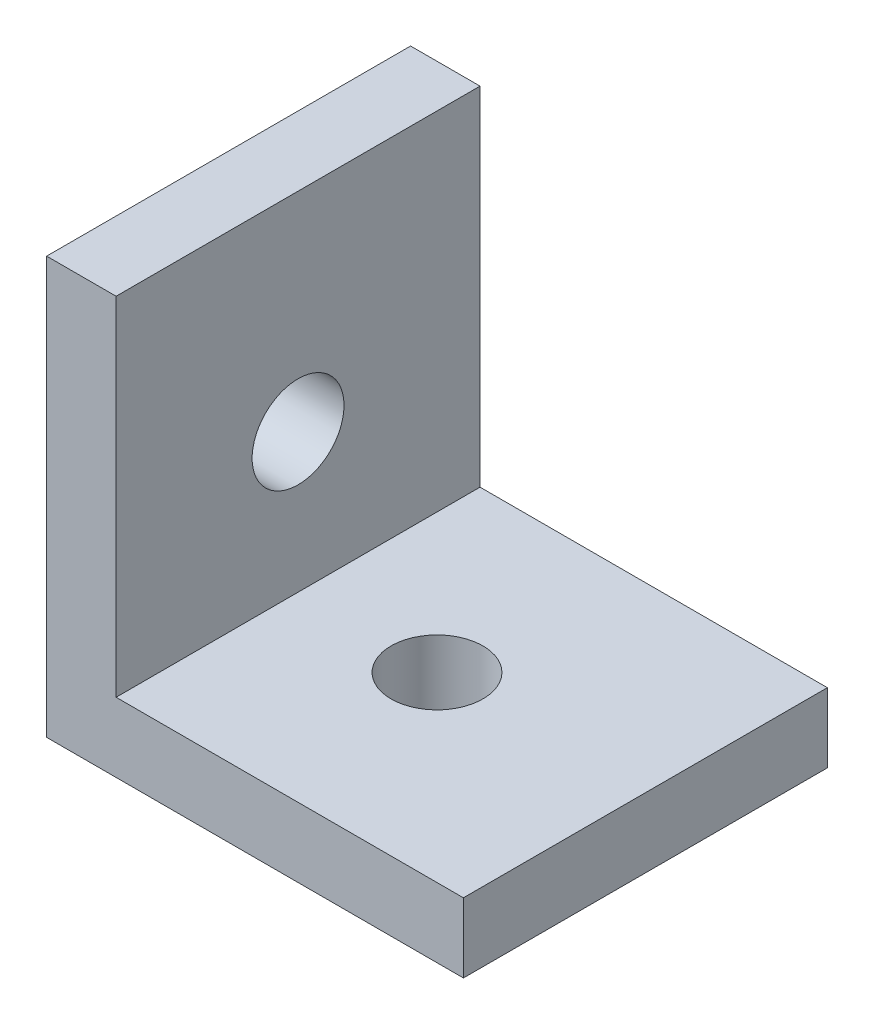
ISO-10303-21;
HEADER;
FILE_DESCRIPTION(('STEP AP214'),'2;1');
FILE_NAME('part.step','',(''),(''),'','','');
FILE_SCHEMA(('AUTOMOTIVE_DESIGN { 1 0 10303 214 1 1 1 1 }'));
ENDSEC;
DATA;
#1=APPLICATION_CONTEXT('core data for automotive mechanical design processes');
#2=APPLICATION_PROTOCOL_DEFINITION('international standard','automotive_design',2000,#1);
#3=PRODUCT_CONTEXT('',#1,'mechanical');
#4=PRODUCT('Part','Part','',(#3));
#5=PRODUCT_RELATED_PRODUCT_CATEGORY('part','',(#4));
#6=PRODUCT_DEFINITION_FORMATION('','',#4);
#7=PRODUCT_DEFINITION_CONTEXT('part definition',#1,'design');
#8=PRODUCT_DEFINITION('design','',#6,#7);
#9=PRODUCT_DEFINITION_SHAPE('','',#8);
#10=(LENGTH_UNIT() NAMED_UNIT(*) SI_UNIT(.MILLI.,.METRE.));
#11=(NAMED_UNIT(*) PLANE_ANGLE_UNIT() SI_UNIT($,.RADIAN.));
#12=(NAMED_UNIT(*) SI_UNIT($,.STERADIAN.) SOLID_ANGLE_UNIT());
#13=UNCERTAINTY_MEASURE_WITH_UNIT(LENGTH_MEASURE(1.E-05),#10,'distance_accuracy_value','');
#14=(GEOMETRIC_REPRESENTATION_CONTEXT(3) GLOBAL_UNCERTAINTY_ASSIGNED_CONTEXT((#13)) GLOBAL_UNIT_ASSIGNED_CONTEXT((#10,
#11,#12)) REPRESENTATION_CONTEXT('',''));
#15=CARTESIAN_POINT('',(0.,0.,0.));
#16=DIRECTION('',(0.,0.,1.));
#17=DIRECTION('',(1.,0.,0.));
#18=AXIS2_PLACEMENT_3D('',#15,#16,#17);
#19=CARTESIAN_POINT('',(0.,38.1,16.635));
#20=DIRECTION('',(1.,0.,0.));
#21=DIRECTION('',(0.,0.,-1.));
#22=AXIS2_PLACEMENT_3D('',#19,#20,#21);
#23=PLANE('',#22);
#24=CARTESIAN_POINT('',(0.,19.05,0.));
#25=DIRECTION('',(1.,0.,0.));
#26=DIRECTION('',(0.,0.,-1.));
#27=AXIS2_PLACEMENT_3D('',#24,#25,#26);
#28=CIRCLE('',#27,4.2);
#29=CARTESIAN_POINT('',(0.,19.05,-4.2));
#30=VERTEX_POINT('',#29);
#31=EDGE_CURVE('E169',#30,#30,#28,.T.);
#32=ORIENTED_EDGE('',*,*,#31,.T.);
#33=EDGE_LOOP('',(#32));
#34=FACE_BOUND('',#33,.T.);
#35=DIRECTION('',(0.,-1.,0.));
#36=VECTOR('',#35,1.);
#37=CARTESIAN_POINT('',(0.,38.1,-16.635));
#38=LINE('',#37,#36);
#39=CARTESIAN_POINT('',(0.,38.1,-16.635));
#40=VERTEX_POINT('',#39);
#41=CARTESIAN_POINT('',(0.,0.,-16.635));
#42=VERTEX_POINT('',#41);
#43=EDGE_CURVE('E123',#40,#42,#38,.T.);
#44=ORIENTED_EDGE('',*,*,#43,.T.);
#45=DIRECTION('',(0.,0.,-1.));
#46=VECTOR('',#45,1.);
#47=CARTESIAN_POINT('',(0.,0.,16.635));
#48=LINE('',#47,#46);
#49=CARTESIAN_POINT('',(0.,0.,16.635));
#50=VERTEX_POINT('',#49);
#51=EDGE_CURVE('E11',#50,#42,#48,.T.);
#52=ORIENTED_EDGE('',*,*,#51,.F.);
#53=DIRECTION('',(0.,-1.,0.));
#54=VECTOR('',#53,1.);
#55=CARTESIAN_POINT('',(0.,38.1,16.635));
#56=LINE('',#55,#54);
#57=CARTESIAN_POINT('',(0.,38.1,16.635));
#58=VERTEX_POINT('',#57);
#59=EDGE_CURVE('E134',#58,#50,#56,.T.);
#60=ORIENTED_EDGE('',*,*,#59,.F.);
#61=DIRECTION('',(0.,0.,-1.));
#62=VECTOR('',#61,1.);
#63=CARTESIAN_POINT('',(0.,38.1,16.635));
#64=LINE('',#63,#62);
#65=EDGE_CURVE('E119',#58,#40,#64,.T.);
#66=ORIENTED_EDGE('',*,*,#65,.T.);
#67=EDGE_LOOP('',(#44,#52,#60,#66));
#68=FACE_BOUND('',#67,.T.);
#69=ADVANCED_FACE('F39',(#34,#68),#23,.F.);
#70=CARTESIAN_POINT('',(0.,0.,16.635));
#71=DIRECTION('',(0.,1.,0.));
#72=DIRECTION('',(0.,0.,1.));
#73=AXIS2_PLACEMENT_3D('',#70,#71,#72);
#74=PLANE('',#73);
#75=CARTESIAN_POINT('',(19.05,0.,0.));
#76=DIRECTION('',(0.,1.,0.));
#77=DIRECTION('',(0.,0.,1.));
#78=AXIS2_PLACEMENT_3D('',#75,#76,#77);
#79=CIRCLE('',#78,4.2);
#80=CARTESIAN_POINT('',(19.05,0.,4.2));
#81=VERTEX_POINT('',#80);
#82=EDGE_CURVE('E127',#81,#81,#79,.T.);
#83=ORIENTED_EDGE('',*,*,#82,.T.);
#84=EDGE_LOOP('',(#83));
#85=FACE_BOUND('',#84,.T.);
#86=DIRECTION('',(1.,0.,0.));
#87=VECTOR('',#86,1.);
#88=CARTESIAN_POINT('',(0.,0.,-16.635));
#89=LINE('',#88,#87);
#90=CARTESIAN_POINT('',(38.1,0.,-16.635));
#91=VERTEX_POINT('',#90);
#92=EDGE_CURVE('E126',#42,#91,#89,.T.);
#93=ORIENTED_EDGE('',*,*,#92,.T.);
#94=DIRECTION('',(0.,0.,-1.));
#95=VECTOR('',#94,1.);
#96=CARTESIAN_POINT('',(38.1,0.,16.635));
#97=LINE('',#96,#95);
#98=CARTESIAN_POINT('',(38.1,0.,16.635));
#99=VERTEX_POINT('',#98);
#100=EDGE_CURVE('E47',#99,#91,#97,.T.);
#101=ORIENTED_EDGE('',*,*,#100,.F.);
#102=DIRECTION('',(1.,0.,0.));
#103=VECTOR('',#102,1.);
#104=CARTESIAN_POINT('',(0.,0.,16.635));
#105=LINE('',#104,#103);
#106=EDGE_CURVE('E92',#50,#99,#105,.T.);
#107=ORIENTED_EDGE('',*,*,#106,.F.);
#108=ORIENTED_EDGE('',*,*,#51,.T.);
#109=EDGE_LOOP('',(#93,#101,#107,#108));
#110=FACE_BOUND('',#109,.T.);
#111=ADVANCED_FACE('F160',(#85,#110),#74,.F.);
#112=CARTESIAN_POINT('',(38.1,0.,16.635));
#113=DIRECTION('',(-1.,0.,0.));
#114=DIRECTION('',(0.,0.,1.));
#115=AXIS2_PLACEMENT_3D('',#112,#113,#114);
#116=PLANE('',#115);
#117=DIRECTION('',(0.,1.,0.));
#118=VECTOR('',#117,1.);
#119=CARTESIAN_POINT('',(38.1,0.,-16.635));
#120=LINE('',#119,#118);
#121=CARTESIAN_POINT('',(38.1,6.35,-16.635));
#122=VERTEX_POINT('',#121);
#123=EDGE_CURVE('E129',#91,#122,#120,.T.);
#124=ORIENTED_EDGE('',*,*,#123,.T.);
#125=DIRECTION('',(0.,0.,-1.));
#126=VECTOR('',#125,1.);
#127=CARTESIAN_POINT('',(38.1,6.35,16.635));
#128=LINE('',#127,#126);
#129=CARTESIAN_POINT('',(38.1,6.35,16.635));
#130=VERTEX_POINT('',#129);
#131=EDGE_CURVE('E114',#130,#122,#128,.T.);
#132=ORIENTED_EDGE('',*,*,#131,.F.);
#133=DIRECTION('',(0.,1.,0.));
#134=VECTOR('',#133,1.);
#135=CARTESIAN_POINT('',(38.1,0.,16.635));
#136=LINE('',#135,#134);
#137=EDGE_CURVE('E105',#99,#130,#136,.T.);
#138=ORIENTED_EDGE('',*,*,#137,.F.);
#139=ORIENTED_EDGE('',*,*,#100,.T.);
#140=EDGE_LOOP('',(#124,#132,#138,#139));
#141=FACE_BOUND('',#140,.T.);
#142=ADVANCED_FACE('F140',(#141),#116,.F.);
#143=CARTESIAN_POINT('',(38.1,6.35,16.635));
#144=DIRECTION('',(0.,-1.,0.));
#145=DIRECTION('',(0.,0.,-1.));
#146=AXIS2_PLACEMENT_3D('',#143,#144,#145);
#147=PLANE('',#146);
#148=CARTESIAN_POINT('',(19.05,6.35,0.));
#149=DIRECTION('',(0.,1.,0.));
#150=DIRECTION('',(0.,0.,1.));
#151=AXIS2_PLACEMENT_3D('',#148,#149,#150);
#152=CIRCLE('',#151,4.2);
#153=CARTESIAN_POINT('',(19.05,6.35,4.2));
#154=VERTEX_POINT('',#153);
#155=EDGE_CURVE('E171',#154,#154,#152,.T.);
#156=ORIENTED_EDGE('',*,*,#155,.F.);
#157=EDGE_LOOP('',(#156));
#158=FACE_BOUND('',#157,.T.);
#159=DIRECTION('',(-1.,0.,0.));
#160=VECTOR('',#159,1.);
#161=CARTESIAN_POINT('',(38.1,6.35,-16.635));
#162=LINE('',#161,#160);
#163=CARTESIAN_POINT('',(6.35,6.35,-16.635));
#164=VERTEX_POINT('',#163);
#165=EDGE_CURVE('E113',#122,#164,#162,.T.);
#166=ORIENTED_EDGE('',*,*,#165,.T.);
#167=DIRECTION('',(0.,0.,-1.));
#168=VECTOR('',#167,1.);
#169=CARTESIAN_POINT('',(6.35,6.35,16.635));
#170=LINE('',#169,#168);
#171=CARTESIAN_POINT('',(6.35,6.35,16.635));
#172=VERTEX_POINT('',#171);
#173=EDGE_CURVE('E110',#172,#164,#170,.T.);
#174=ORIENTED_EDGE('',*,*,#173,.F.);
#175=DIRECTION('',(-1.,0.,0.));
#176=VECTOR('',#175,1.);
#177=CARTESIAN_POINT('',(38.1,6.35,16.635));
#178=LINE('',#177,#176);
#179=EDGE_CURVE('E99',#130,#172,#178,.T.);
#180=ORIENTED_EDGE('',*,*,#179,.F.);
#181=ORIENTED_EDGE('',*,*,#131,.T.);
#182=EDGE_LOOP('',(#166,#174,#180,#181));
#183=FACE_BOUND('',#182,.T.);
#184=ADVANCED_FACE('F111',(#158,#183),#147,.F.);
#185=CARTESIAN_POINT('',(6.35,6.35,16.635));
#186=DIRECTION('',(-1.,0.,0.));
#187=DIRECTION('',(0.,0.,1.));
#188=AXIS2_PLACEMENT_3D('',#185,#186,#187);
#189=PLANE('',#188);
#190=CARTESIAN_POINT('',(6.35,19.05,0.));
#191=DIRECTION('',(1.,0.,0.));
#192=DIRECTION('',(0.,0.,-1.));
#193=AXIS2_PLACEMENT_3D('',#190,#191,#192);
#194=CIRCLE('',#193,4.2);
#195=CARTESIAN_POINT('',(6.35,19.05,-4.2));
#196=VERTEX_POINT('',#195);
#197=EDGE_CURVE('E172',#196,#196,#194,.T.);
#198=ORIENTED_EDGE('',*,*,#197,.F.);
#199=EDGE_LOOP('',(#198));
#200=FACE_BOUND('',#199,.T.);
#201=DIRECTION('',(0.,1.,0.));
#202=VECTOR('',#201,1.);
#203=CARTESIAN_POINT('',(6.35,6.35,-16.635));
#204=LINE('',#203,#202);
#205=CARTESIAN_POINT('',(6.35,38.1,-16.635));
#206=VERTEX_POINT('',#205);
#207=EDGE_CURVE('E78',#164,#206,#204,.T.);
#208=ORIENTED_EDGE('',*,*,#207,.T.);
#209=DIRECTION('',(0.,0.,-1.));
#210=VECTOR('',#209,1.);
#211=CARTESIAN_POINT('',(6.35,38.1,16.635));
#212=LINE('',#211,#210);
#213=CARTESIAN_POINT('',(6.35,38.1,16.635));
#214=VERTEX_POINT('',#213);
#215=EDGE_CURVE('E115',#214,#206,#212,.T.);
#216=ORIENTED_EDGE('',*,*,#215,.F.);
#217=DIRECTION('',(0.,1.,0.));
#218=VECTOR('',#217,1.);
#219=CARTESIAN_POINT('',(6.35,6.35,16.635));
#220=LINE('',#219,#218);
#221=EDGE_CURVE('E103',#172,#214,#220,.T.);
#222=ORIENTED_EDGE('',*,*,#221,.F.);
#223=ORIENTED_EDGE('',*,*,#173,.T.);
#224=EDGE_LOOP('',(#208,#216,#222,#223));
#225=FACE_BOUND('',#224,.T.);
#226=ADVANCED_FACE('F117',(#200,#225),#189,.F.);
#227=CARTESIAN_POINT('',(6.35,38.1,16.635));
#228=DIRECTION('',(0.,-1.,0.));
#229=DIRECTION('',(0.,0.,-1.));
#230=AXIS2_PLACEMENT_3D('',#227,#228,#229);
#231=PLANE('',#230);
#232=DIRECTION('',(-1.,0.,0.));
#233=VECTOR('',#232,1.);
#234=CARTESIAN_POINT('',(6.35,38.1,-16.635));
#235=LINE('',#234,#233);
#236=EDGE_CURVE('E84',#206,#40,#235,.T.);
#237=ORIENTED_EDGE('',*,*,#236,.T.);
#238=ORIENTED_EDGE('',*,*,#65,.F.);
#239=DIRECTION('',(-1.,0.,0.));
#240=VECTOR('',#239,1.);
#241=CARTESIAN_POINT('',(6.35,38.1,16.635));
#242=LINE('',#241,#240);
#243=EDGE_CURVE('E55',#214,#58,#242,.T.);
#244=ORIENTED_EDGE('',*,*,#243,.F.);
#245=ORIENTED_EDGE('',*,*,#215,.T.);
#246=EDGE_LOOP('',(#237,#238,#244,#245));
#247=FACE_BOUND('',#246,.T.);
#248=ADVANCED_FACE('F147',(#247),#231,.F.);
#249=CARTESIAN_POINT('',(0.,0.,16.635));
#250=DIRECTION('',(0.,0.,1.));
#251=DIRECTION('',(1.,0.,0.));
#252=AXIS2_PLACEMENT_3D('',#249,#250,#251);
#253=PLANE('',#252);
#254=ORIENTED_EDGE('',*,*,#59,.T.);
#255=ORIENTED_EDGE('',*,*,#106,.T.);
#256=ORIENTED_EDGE('',*,*,#137,.T.);
#257=ORIENTED_EDGE('',*,*,#179,.T.);
#258=ORIENTED_EDGE('',*,*,#221,.T.);
#259=ORIENTED_EDGE('',*,*,#243,.T.);
#260=EDGE_LOOP('',(#254,#255,#256,#257,#258,#259));
#261=FACE_BOUND('',#260,.T.);
#262=ADVANCED_FACE('F101',(#261),#253,.T.);
#263=CARTESIAN_POINT('',(0.,0.,-16.635));
#264=DIRECTION('',(0.,0.,1.));
#265=DIRECTION('',(1.,0.,0.));
#266=AXIS2_PLACEMENT_3D('',#263,#264,#265);
#267=PLANE('',#266);
#268=ORIENTED_EDGE('',*,*,#43,.F.);
#269=ORIENTED_EDGE('',*,*,#236,.F.);
#270=ORIENTED_EDGE('',*,*,#207,.F.);
#271=ORIENTED_EDGE('',*,*,#165,.F.);
#272=ORIENTED_EDGE('',*,*,#123,.F.);
#273=ORIENTED_EDGE('',*,*,#92,.F.);
#274=EDGE_LOOP('',(#268,#269,#270,#271,#272,#273));
#275=FACE_BOUND('',#274,.T.);
#276=ADVANCED_FACE('F143',(#275),#267,.F.);
#277=CARTESIAN_POINT('',(19.05,0.,0.));
#278=DIRECTION('',(0.,1.,0.));
#279=DIRECTION('',(0.,0.,1.));
#280=AXIS2_PLACEMENT_3D('',#277,#278,#279);
#281=CYLINDRICAL_SURFACE('',#280,4.2);
#282=ORIENTED_EDGE('',*,*,#82,.F.);
#283=EDGE_LOOP('',(#282));
#284=FACE_BOUND('',#283,.T.);
#285=ORIENTED_EDGE('',*,*,#155,.T.);
#286=EDGE_LOOP('',(#285));
#287=FACE_BOUND('',#286,.T.);
#288=ADVANCED_FACE('F184',(#284,#287),#281,.F.);
#289=CARTESIAN_POINT('',(0.,19.05,0.));
#290=DIRECTION('',(1.,0.,0.));
#291=DIRECTION('',(0.,0.,-1.));
#292=AXIS2_PLACEMENT_3D('',#289,#290,#291);
#293=CYLINDRICAL_SURFACE('',#292,4.2);
#294=ORIENTED_EDGE('',*,*,#31,.F.);
#295=EDGE_LOOP('',(#294));
#296=FACE_BOUND('',#295,.T.);
#297=ORIENTED_EDGE('',*,*,#197,.T.);
#298=EDGE_LOOP('',(#297));
#299=FACE_BOUND('',#298,.T.);
#300=ADVANCED_FACE('F186',(#296,#299),#293,.F.);
#301=CLOSED_SHELL('',(#69,#111,#142,#184,#226,#248,#262,#276,#288,#300));
#302=MANIFOLD_SOLID_BREP('B2',#301);
#303=ADVANCED_BREP_SHAPE_REPRESENTATION('',(#18,#302),#14);
#304=SHAPE_DEFINITION_REPRESENTATION(#9,#303);
ENDSEC;
END-ISO-10303-21;
